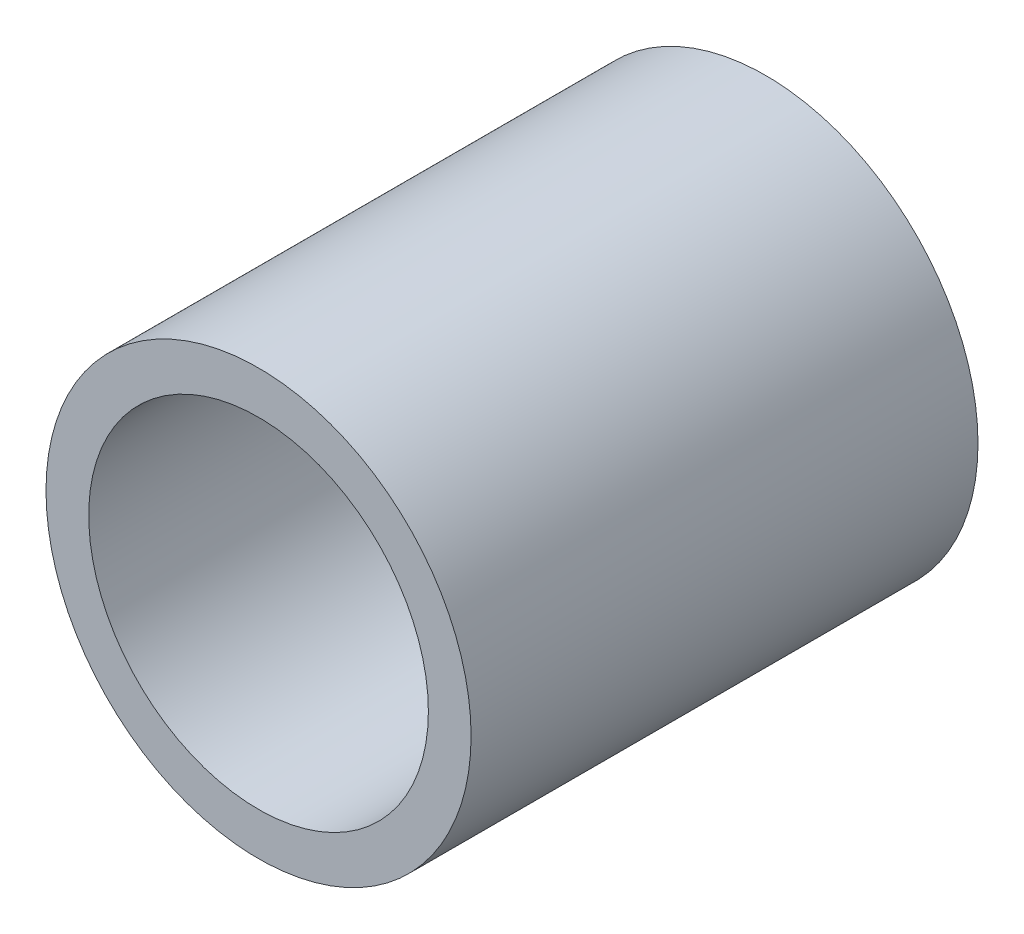
ISO-10303-21;
HEADER;
FILE_DESCRIPTION(('STEP AP214'),'2;1');
FILE_NAME('part.step','',(''),(''),'','','');
FILE_SCHEMA(('AUTOMOTIVE_DESIGN { 1 0 10303 214 1 1 1 1 }'));
ENDSEC;
DATA;
#1=APPLICATION_CONTEXT('core data for automotive mechanical design processes');
#2=APPLICATION_PROTOCOL_DEFINITION('international standard','automotive_design',2000,#1);
#3=PRODUCT_CONTEXT('',#1,'mechanical');
#4=PRODUCT('Part','Part','',(#3));
#5=PRODUCT_RELATED_PRODUCT_CATEGORY('part','',(#4));
#6=PRODUCT_DEFINITION_FORMATION('','',#4);
#7=PRODUCT_DEFINITION_CONTEXT('part definition',#1,'design');
#8=PRODUCT_DEFINITION('design','',#6,#7);
#9=PRODUCT_DEFINITION_SHAPE('','',#8);
#10=(LENGTH_UNIT() NAMED_UNIT(*) SI_UNIT(.MILLI.,.METRE.));
#11=(NAMED_UNIT(*) PLANE_ANGLE_UNIT() SI_UNIT($,.RADIAN.));
#12=(NAMED_UNIT(*) SI_UNIT($,.STERADIAN.) SOLID_ANGLE_UNIT());
#13=UNCERTAINTY_MEASURE_WITH_UNIT(LENGTH_MEASURE(1.E-05),#10,'distance_accuracy_value','');
#14=(GEOMETRIC_REPRESENTATION_CONTEXT(3) GLOBAL_UNCERTAINTY_ASSIGNED_CONTEXT((#13)) GLOBAL_UNIT_ASSIGNED_CONTEXT((#10,
#11,#12)) REPRESENTATION_CONTEXT('',''));
#15=CARTESIAN_POINT('',(0.,0.,0.));
#16=DIRECTION('',(0.,0.,1.));
#17=DIRECTION('',(1.,0.,0.));
#18=AXIS2_PLACEMENT_3D('',#15,#16,#17);
#19=CARTESIAN_POINT('',(0.,0.,25.4));
#20=DIRECTION('',(0.,0.,1.));
#21=DIRECTION('',(1.,0.,0.));
#22=AXIS2_PLACEMENT_3D('',#19,#20,#21);
#23=PLANE('',#22);
#24=CARTESIAN_POINT('',(0.,0.,25.4));
#25=DIRECTION('',(0.,0.,1.));
#26=DIRECTION('',(1.,0.,0.));
#27=AXIS2_PLACEMENT_3D('',#24,#25,#26);
#28=CIRCLE('',#27,10.65);
#29=CARTESIAN_POINT('',(10.65,0.,25.4));
#30=VERTEX_POINT('',#29);
#31=EDGE_CURVE('E10',#30,#30,#28,.T.);
#32=ORIENTED_EDGE('',*,*,#31,.T.);
#33=EDGE_LOOP('',(#32));
#34=FACE_BOUND('',#33,.T.);
#35=CARTESIAN_POINT('',(0.,0.,25.4));
#36=DIRECTION('',(0.,0.,1.));
#37=DIRECTION('',(1.,0.,0.));
#38=AXIS2_PLACEMENT_3D('',#35,#36,#37);
#39=CIRCLE('',#38,8.51);
#40=CARTESIAN_POINT('',(8.51,0.,25.4));
#41=VERTEX_POINT('',#40);
#42=EDGE_CURVE('E48',#41,#41,#39,.T.);
#43=ORIENTED_EDGE('',*,*,#42,.F.);
#44=EDGE_LOOP('',(#43));
#45=FACE_BOUND('',#44,.T.);
#46=ADVANCED_FACE('F34',(#34,#45),#23,.T.);
#47=CARTESIAN_POINT('',(0.,0.,0.));
#48=DIRECTION('',(0.,0.,1.));
#49=DIRECTION('',(1.,0.,0.));
#50=AXIS2_PLACEMENT_3D('',#47,#48,#49);
#51=PLANE('',#50);
#52=CARTESIAN_POINT('',(0.,0.,0.));
#53=DIRECTION('',(0.,0.,1.));
#54=DIRECTION('',(1.,0.,0.));
#55=AXIS2_PLACEMENT_3D('',#52,#53,#54);
#56=CIRCLE('',#55,10.65);
#57=CARTESIAN_POINT('',(10.65,0.,0.));
#58=VERTEX_POINT('',#57);
#59=EDGE_CURVE('E38',#58,#58,#56,.T.);
#60=ORIENTED_EDGE('',*,*,#59,.F.);
#61=EDGE_LOOP('',(#60));
#62=FACE_BOUND('',#61,.T.);
#63=CARTESIAN_POINT('',(0.,0.,0.));
#64=DIRECTION('',(0.,0.,1.));
#65=DIRECTION('',(1.,0.,0.));
#66=AXIS2_PLACEMENT_3D('',#63,#64,#65);
#67=CIRCLE('',#66,8.51);
#68=CARTESIAN_POINT('',(8.51,0.,0.));
#69=VERTEX_POINT('',#68);
#70=EDGE_CURVE('E50',#69,#69,#67,.T.);
#71=ORIENTED_EDGE('',*,*,#70,.T.);
#72=EDGE_LOOP('',(#71));
#73=FACE_BOUND('',#72,.T.);
#74=ADVANCED_FACE('F63',(#62,#73),#51,.F.);
#75=CARTESIAN_POINT('',(0.,0.,25.4));
#76=DIRECTION('',(0.,0.,-1.));
#77=DIRECTION('',(-1.,0.,0.));
#78=AXIS2_PLACEMENT_3D('',#75,#76,#77);
#79=CYLINDRICAL_SURFACE('',#78,10.65);
#80=ORIENTED_EDGE('',*,*,#31,.F.);
#81=EDGE_LOOP('',(#80));
#82=FACE_BOUND('',#81,.T.);
#83=ORIENTED_EDGE('',*,*,#59,.T.);
#84=EDGE_LOOP('',(#83));
#85=FACE_BOUND('',#84,.T.);
#86=ADVANCED_FACE('F36',(#82,#85),#79,.T.);
#87=CARTESIAN_POINT('',(0.,0.,25.4));
#88=DIRECTION('',(0.,0.,-1.));
#89=DIRECTION('',(-1.,0.,0.));
#90=AXIS2_PLACEMENT_3D('',#87,#88,#89);
#91=CYLINDRICAL_SURFACE('',#90,8.51);
#92=ORIENTED_EDGE('',*,*,#42,.T.);
#93=EDGE_LOOP('',(#92));
#94=FACE_BOUND('',#93,.T.);
#95=ORIENTED_EDGE('',*,*,#70,.F.);
#96=EDGE_LOOP('',(#95));
#97=FACE_BOUND('',#96,.T.);
#98=ADVANCED_FACE('F59',(#94,#97),#91,.F.);
#99=CLOSED_SHELL('',(#46,#74,#86,#98));
#100=MANIFOLD_SOLID_BREP('B2',#99);
#101=ADVANCED_BREP_SHAPE_REPRESENTATION('',(#18,#100),#14);
#102=SHAPE_DEFINITION_REPRESENTATION(#9,#101);
ENDSEC;
END-ISO-10303-21;
